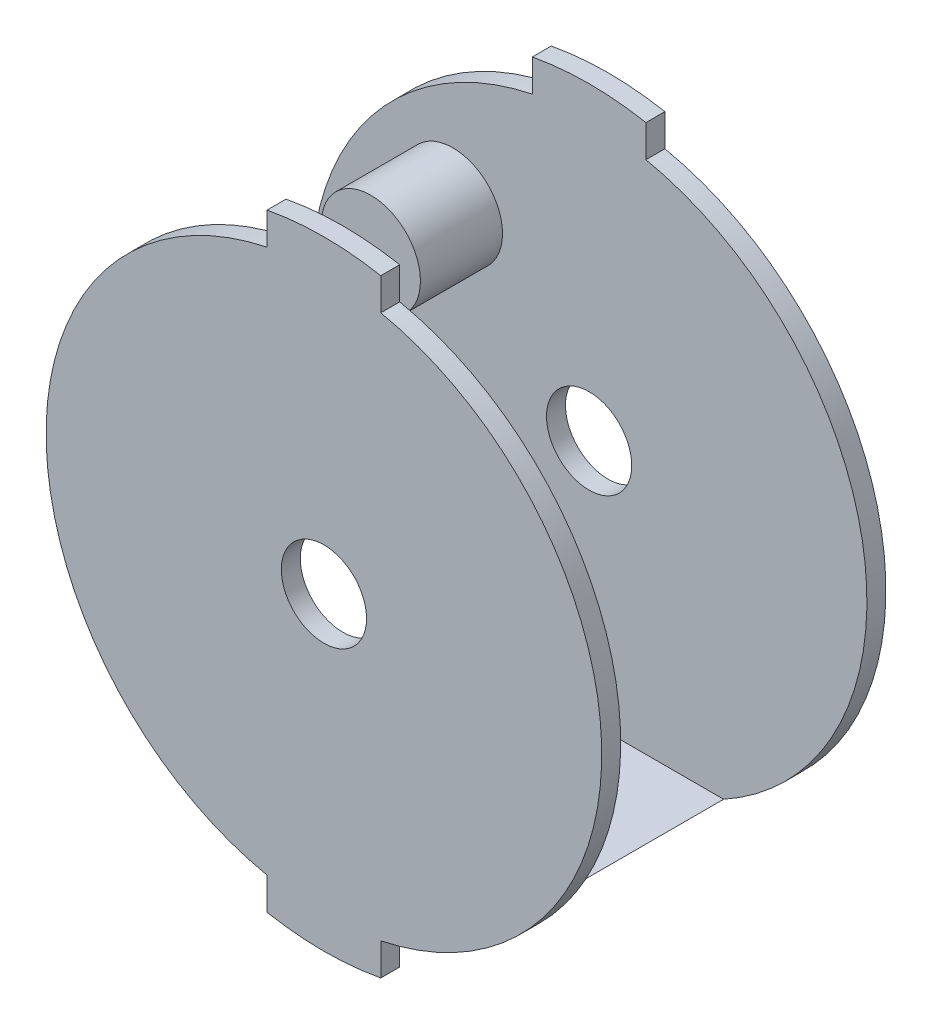
ISO-10303-21;
HEADER;
FILE_DESCRIPTION(('STEP AP214'),'2;1');
FILE_NAME('part.step','',(''),(''),'','','');
FILE_SCHEMA(('AUTOMOTIVE_DESIGN { 1 0 10303 214 1 1 1 1 }'));
ENDSEC;
DATA;
#1=APPLICATION_CONTEXT('core data for automotive mechanical design processes');
#2=APPLICATION_PROTOCOL_DEFINITION('international standard','automotive_design',2000,#1);
#3=PRODUCT_CONTEXT('',#1,'mechanical');
#4=PRODUCT('Part','Part','',(#3));
#5=PRODUCT_RELATED_PRODUCT_CATEGORY('part','',(#4));
#6=PRODUCT_DEFINITION_FORMATION('','',#4);
#7=PRODUCT_DEFINITION_CONTEXT('part definition',#1,'design');
#8=PRODUCT_DEFINITION('design','',#6,#7);
#9=PRODUCT_DEFINITION_SHAPE('','',#8);
#10=(LENGTH_UNIT() NAMED_UNIT(*) SI_UNIT(.MILLI.,.METRE.));
#11=(NAMED_UNIT(*) PLANE_ANGLE_UNIT() SI_UNIT($,.RADIAN.));
#12=(NAMED_UNIT(*) SI_UNIT($,.STERADIAN.) SOLID_ANGLE_UNIT());
#13=UNCERTAINTY_MEASURE_WITH_UNIT(LENGTH_MEASURE(1.E-05),#10,'distance_accuracy_value','');
#14=(GEOMETRIC_REPRESENTATION_CONTEXT(3) GLOBAL_UNCERTAINTY_ASSIGNED_CONTEXT((#13)) GLOBAL_UNIT_ASSIGNED_CONTEXT((#10,
#11,#12)) REPRESENTATION_CONTEXT('',''));
#15=CARTESIAN_POINT('',(0.,0.,0.));
#16=DIRECTION('',(0.,0.,1.));
#17=DIRECTION('',(1.,0.,0.));
#18=AXIS2_PLACEMENT_3D('',#15,#16,#17);
#19=CARTESIAN_POINT('',(0.,11.176,0.762));
#20=DIRECTION('',(0.,0.,1.));
#21=DIRECTION('',(1.,0.,0.));
#22=AXIS2_PLACEMENT_3D('',#19,#20,#21);
#23=PLANE('',#22);
#24=CARTESIAN_POINT('',(0.,0.,0.761999999999999));
#25=DIRECTION('',(0.,0.,-1.));
#26=DIRECTION('',(0.,1.,0.));
#27=AXIS2_PLACEMENT_3D('',#24,#25,#26);
#28=CIRCLE('',#27,1.7145);
#29=CARTESIAN_POINT('',(0.,1.7145,0.761999999999999));
#30=VERTEX_POINT('',#29);
#31=EDGE_CURVE('E205',#30,#30,#28,.T.);
#32=ORIENTED_EDGE('',*,*,#31,.T.);
#33=EDGE_LOOP('',(#32));
#34=FACE_BOUND('',#33,.T.);
#35=DIRECTION('',(0.,-1.,0.));
#36=VECTOR('',#35,1.);
#37=CARTESIAN_POINT('',(-2.286,12.234260092053,0.762000000000001));
#38=LINE('',#37,#36);
#39=CARTESIAN_POINT('',(-2.286,12.234260092053,0.762000000000001));
#40=VERTEX_POINT('',#39);
#41=CARTESIAN_POINT('',(-2.286,10.9397065774179,0.762));
#42=VERTEX_POINT('',#41);
#43=EDGE_CURVE('E204',#40,#42,#38,.T.);
#44=ORIENTED_EDGE('',*,*,#43,.T.);
#45=CARTESIAN_POINT('',(0.,0.,0.761999999999999));
#46=DIRECTION('',(0.,0.,-1.));
#47=DIRECTION('',(0.,1.,0.));
#48=AXIS2_PLACEMENT_3D('',#45,#46,#47);
#49=CIRCLE('',#48,11.176);
#50=CARTESIAN_POINT('',(-5.41055773465175,-9.779,0.761999999999998));
#51=VERTEX_POINT('',#50);
#52=EDGE_CURVE('E208',#51,#42,#49,.T.);
#53=ORIENTED_EDGE('',*,*,#52,.F.);
#54=DIRECTION('',(1.,0.,0.));
#55=VECTOR('',#54,1.);
#56=CARTESIAN_POINT('',(-11.176,-9.779,0.761999999999998));
#57=LINE('',#56,#55);
#58=CARTESIAN_POINT('',(5.41055773465175,-9.779,0.761999999999998));
#59=VERTEX_POINT('',#58);
#60=EDGE_CURVE('E213',#51,#59,#57,.T.);
#61=ORIENTED_EDGE('',*,*,#60,.T.);
#62=CARTESIAN_POINT('',(2.286,10.9397065774179,0.762));
#63=VERTEX_POINT('',#62);
#64=EDGE_CURVE('E314',#63,#59,#49,.T.);
#65=ORIENTED_EDGE('',*,*,#64,.F.);
#66=DIRECTION('',(0.,1.,0.));
#67=VECTOR('',#66,1.);
#68=CARTESIAN_POINT('',(2.286,12.234260092053,0.762000000000001));
#69=LINE('',#68,#67);
#70=CARTESIAN_POINT('',(2.286,12.234260092053,0.762000000000001));
#71=VERTEX_POINT('',#70);
#72=EDGE_CURVE('E299',#63,#71,#69,.T.);
#73=ORIENTED_EDGE('',*,*,#72,.T.);
#74=CARTESIAN_POINT('',(0.,0.,0.762000000000001));
#75=DIRECTION('',(0.,0.,1.));
#76=DIRECTION('',(1.,0.,0.));
#77=AXIS2_PLACEMENT_3D('',#74,#75,#76);
#78=CIRCLE('',#77,12.446);
#79=EDGE_CURVE('E301',#71,#40,#78,.T.);
#80=ORIENTED_EDGE('',*,*,#79,.T.);
#81=EDGE_LOOP('',(#44,#53,#61,#65,#73,#80));
#82=FACE_BOUND('',#81,.T.);
#83=CARTESIAN_POINT('',(-5.47795623385217,5.47795623385219,0.762000000000001));
#84=DIRECTION('',(0.,0.,1.));
#85=DIRECTION('',(1.,0.,0.));
#86=AXIS2_PLACEMENT_3D('',#83,#84,#85);
#87=CIRCLE('',#86,1.9939);
#88=CARTESIAN_POINT('',(-3.48405623385217,5.47795623385219,0.762000000000001));
#89=VERTEX_POINT('',#88);
#90=EDGE_CURVE('E37',#89,#89,#87,.F.);
#91=ORIENTED_EDGE('',*,*,#90,.T.);
#92=EDGE_LOOP('',(#91));
#93=FACE_BOUND('',#92,.T.);
#94=ADVANCED_FACE('F33',(#34,#82,#93),#23,.T.);
#95=CARTESIAN_POINT('',(0.,0.,11.43));
#96=DIRECTION('',(0.,0.,-1.));
#97=DIRECTION('',(-1.,0.,0.));
#98=AXIS2_PLACEMENT_3D('',#95,#96,#97);
#99=CYLINDRICAL_SURFACE('',#98,11.176);
#100=DIRECTION('',(0.,0.,-1.));
#101=VECTOR('',#100,1.);
#102=CARTESIAN_POINT('',(3.71352864537221,-10.541,11.43));
#103=LINE('',#102,#101);
#104=CARTESIAN_POINT('',(3.71352864537221,-10.541,10.668));
#105=VERTEX_POINT('',#104);
#106=CARTESIAN_POINT('',(3.71352864537221,-10.541,0.762000000000001));
#107=VERTEX_POINT('',#106);
#108=EDGE_CURVE('E173',#105,#107,#103,.T.);
#109=ORIENTED_EDGE('',*,*,#108,.T.);
#110=CARTESIAN_POINT('',(0.,0.,0.762000000000001));
#111=DIRECTION('',(0.,0.,-1.));
#112=DIRECTION('',(-1.,0.,0.));
#113=AXIS2_PLACEMENT_3D('',#110,#111,#112);
#114=CIRCLE('',#113,11.176);
#115=CARTESIAN_POINT('',(2.286,-10.9397065774179,0.762000000000001));
#116=VERTEX_POINT('',#115);
#117=EDGE_CURVE('E11',#107,#116,#114,.T.);
#118=ORIENTED_EDGE('',*,*,#117,.T.);
#119=DIRECTION('',(0.,0.,-1.));
#120=VECTOR('',#119,1.);
#121=CARTESIAN_POINT('',(2.286,-10.9397065774179,11.43));
#122=LINE('',#121,#120);
#123=CARTESIAN_POINT('',(2.286,-10.9397065774179,0.));
#124=VERTEX_POINT('',#123);
#125=EDGE_CURVE('E230',#116,#124,#122,.T.);
#126=ORIENTED_EDGE('',*,*,#125,.T.);
#127=CARTESIAN_POINT('',(0.,0.,0.));
#128=DIRECTION('',(0.,0.,1.));
#129=DIRECTION('',(1.,0.,0.));
#130=AXIS2_PLACEMENT_3D('',#127,#128,#129);
#131=CIRCLE('',#130,11.176);
#132=CARTESIAN_POINT('',(2.286,10.9397065774179,0.));
#133=VERTEX_POINT('',#132);
#134=EDGE_CURVE('E256',#124,#133,#131,.T.);
#135=ORIENTED_EDGE('',*,*,#134,.T.);
#136=DIRECTION('',(0.,0.,-1.));
#137=VECTOR('',#136,1.);
#138=CARTESIAN_POINT('',(2.286,10.9397065774179,11.43));
#139=LINE('',#138,#137);
#140=EDGE_CURVE('E234',#63,#133,#139,.T.);
#141=ORIENTED_EDGE('',*,*,#140,.F.);
#142=ORIENTED_EDGE('',*,*,#64,.T.);
#143=DIRECTION('',(0.,0.,-1.));
#144=VECTOR('',#143,1.);
#145=CARTESIAN_POINT('',(5.41055773465175,-9.779,11.43));
#146=LINE('',#145,#144);
#147=CARTESIAN_POINT('',(5.41055773465175,-9.779,10.668));
#148=VERTEX_POINT('',#147);
#149=EDGE_CURVE('E199',#59,#148,#146,.F.);
#150=ORIENTED_EDGE('',*,*,#149,.T.);
#151=CARTESIAN_POINT('',(0.,0.,10.668));
#152=DIRECTION('',(0.,0.,1.));
#153=DIRECTION('',(0.,-1.,0.));
#154=AXIS2_PLACEMENT_3D('',#151,#152,#153);
#155=CIRCLE('',#154,11.176);
#156=CARTESIAN_POINT('',(2.286,10.9397065774179,10.668));
#157=VERTEX_POINT('',#156);
#158=EDGE_CURVE('E209',#148,#157,#155,.T.);
#159=ORIENTED_EDGE('',*,*,#158,.T.);
#160=CARTESIAN_POINT('',(2.286,10.9397065774179,11.43));
#161=VERTEX_POINT('',#160);
#162=EDGE_CURVE('E231',#161,#157,#139,.T.);
#163=ORIENTED_EDGE('',*,*,#162,.F.);
#164=CARTESIAN_POINT('',(0.,0.,11.43));
#165=DIRECTION('',(0.,0.,1.));
#166=DIRECTION('',(1.,0.,0.));
#167=AXIS2_PLACEMENT_3D('',#164,#165,#166);
#168=CIRCLE('',#167,11.176);
#169=CARTESIAN_POINT('',(2.286,-10.9397065774179,11.43));
#170=VERTEX_POINT('',#169);
#171=EDGE_CURVE('E278',#170,#161,#168,.T.);
#172=ORIENTED_EDGE('',*,*,#171,.F.);
#173=CARTESIAN_POINT('',(2.286,-10.9397065774179,10.668));
#174=VERTEX_POINT('',#173);
#175=EDGE_CURVE('E191',#170,#174,#122,.T.);
#176=ORIENTED_EDGE('',*,*,#175,.T.);
#177=CARTESIAN_POINT('',(0.,0.,10.668));
#178=DIRECTION('',(0.,0.,1.));
#179=DIRECTION('',(1.,0.,0.));
#180=AXIS2_PLACEMENT_3D('',#177,#178,#179);
#181=CIRCLE('',#180,11.176);
#182=EDGE_CURVE('E42',#174,#105,#181,.T.);
#183=ORIENTED_EDGE('',*,*,#182,.T.);
#184=EDGE_LOOP('',(#109,#118,#126,#135,#141,#142,#150,#159,#163,#172,#176,#183));
#185=FACE_BOUND('',#184,.T.);
#186=ADVANCED_FACE('F188',(#185),#99,.T.);
#187=CARTESIAN_POINT('',(0.,0.,11.43));
#188=DIRECTION('',(0.,0.,-1.));
#189=DIRECTION('',(-1.,0.,0.));
#190=AXIS2_PLACEMENT_3D('',#187,#188,#189);
#191=CYLINDRICAL_SURFACE('',#190,1.7145);
#192=ORIENTED_EDGE('',*,*,#31,.F.);
#193=EDGE_LOOP('',(#192));
#194=FACE_BOUND('',#193,.T.);
#195=CARTESIAN_POINT('',(0.,0.,0.));
#196=DIRECTION('',(0.,0.,1.));
#197=DIRECTION('',(1.,0.,0.));
#198=AXIS2_PLACEMENT_3D('',#195,#196,#197);
#199=CIRCLE('',#198,1.7145);
#200=CARTESIAN_POINT('',(1.7145,0.,0.));
#201=VERTEX_POINT('',#200);
#202=EDGE_CURVE('E288',#201,#201,#199,.T.);
#203=ORIENTED_EDGE('',*,*,#202,.F.);
#204=EDGE_LOOP('',(#203));
#205=FACE_BOUND('',#204,.T.);
#206=ADVANCED_FACE('F351',(#194,#205),#191,.F.);
#207=CARTESIAN_POINT('',(-2.286,-10.9397065774179,11.43));
#208=DIRECTION('',(1.,0.,0.));
#209=DIRECTION('',(0.,0.,-1.));
#210=AXIS2_PLACEMENT_3D('',#207,#208,#209);
#211=PLANE('',#210);
#212=DIRECTION('',(0.,-1.,0.));
#213=VECTOR('',#212,1.);
#214=CARTESIAN_POINT('',(-2.286,-10.9397065774179,0.762000000000001));
#215=LINE('',#214,#213);
#216=CARTESIAN_POINT('',(-2.286,-10.9397065774179,0.762000000000001));
#217=VERTEX_POINT('',#216);
#218=CARTESIAN_POINT('',(-2.286,-12.234260092053,0.762000000000001));
#219=VERTEX_POINT('',#218);
#220=EDGE_CURVE('E291',#217,#219,#215,.T.);
#221=ORIENTED_EDGE('',*,*,#220,.F.);
#222=DIRECTION('',(0.,0.,-1.));
#223=VECTOR('',#222,1.);
#224=CARTESIAN_POINT('',(-2.286,-10.9397065774179,11.43));
#225=LINE('',#224,#223);
#226=CARTESIAN_POINT('',(-2.286,-10.9397065774179,0.));
#227=VERTEX_POINT('',#226);
#228=EDGE_CURVE('E220',#217,#227,#225,.T.);
#229=ORIENTED_EDGE('',*,*,#228,.T.);
#230=DIRECTION('',(0.,-1.,0.));
#231=VECTOR('',#230,1.);
#232=CARTESIAN_POINT('',(-2.286,-10.9397065774179,0.));
#233=LINE('',#232,#231);
#234=CARTESIAN_POINT('',(-2.286,-12.234260092053,0.));
#235=VERTEX_POINT('',#234);
#236=EDGE_CURVE('E265',#227,#235,#233,.T.);
#237=ORIENTED_EDGE('',*,*,#236,.T.);
#238=DIRECTION('',(0.,0.,-1.));
#239=VECTOR('',#238,1.);
#240=CARTESIAN_POINT('',(-2.286,-12.234260092053,11.43));
#241=LINE('',#240,#239);
#242=EDGE_CURVE('E224',#219,#235,#241,.T.);
#243=ORIENTED_EDGE('',*,*,#242,.F.);
#244=EDGE_LOOP('',(#221,#229,#237,#243));
#245=FACE_BOUND('',#244,.T.);
#246=ADVANCED_FACE('F35',(#245),#211,.F.);
#247=DIRECTION('',(0.,1.,0.));
#248=VECTOR('',#247,1.);
#249=CARTESIAN_POINT('',(-2.286,-10.9397065774179,10.668));
#250=LINE('',#249,#248);
#251=CARTESIAN_POINT('',(-2.286,-12.234260092053,10.668));
#252=VERTEX_POINT('',#251);
#253=CARTESIAN_POINT('',(-2.286,-10.9397065774179,10.668));
#254=VERTEX_POINT('',#253);
#255=EDGE_CURVE('E303',#252,#254,#250,.T.);
#256=ORIENTED_EDGE('',*,*,#255,.F.);
#257=CARTESIAN_POINT('',(-2.286,-12.234260092053,11.43));
#258=VERTEX_POINT('',#257);
#259=EDGE_CURVE('E221',#258,#252,#241,.T.);
#260=ORIENTED_EDGE('',*,*,#259,.F.);
#261=DIRECTION('',(0.,-1.,0.));
#262=VECTOR('',#261,1.);
#263=CARTESIAN_POINT('',(-2.286,-10.9397065774179,11.43));
#264=LINE('',#263,#262);
#265=CARTESIAN_POINT('',(-2.286,-10.9397065774179,11.43));
#266=VERTEX_POINT('',#265);
#267=EDGE_CURVE('E284',#266,#258,#264,.T.);
#268=ORIENTED_EDGE('',*,*,#267,.F.);
#269=EDGE_CURVE('E218',#266,#254,#225,.T.);
#270=ORIENTED_EDGE('',*,*,#269,.T.);
#271=EDGE_LOOP('',(#256,#260,#268,#270));
#272=FACE_BOUND('',#271,.T.);
#273=ADVANCED_FACE('F416',(#272),#211,.F.);
#274=CARTESIAN_POINT('',(0.,0.,11.43));
#275=DIRECTION('',(0.,0.,-1.));
#276=DIRECTION('',(-1.,0.,0.));
#277=AXIS2_PLACEMENT_3D('',#274,#275,#276);
#278=CYLINDRICAL_SURFACE('',#277,12.446);
#279=CARTESIAN_POINT('',(0.,0.,0.762000000000001));
#280=DIRECTION('',(0.,0.,1.));
#281=DIRECTION('',(1.,0.,0.));
#282=AXIS2_PLACEMENT_3D('',#279,#280,#281);
#283=CIRCLE('',#282,12.446);
#284=CARTESIAN_POINT('',(2.286,-12.234260092053,0.762000000000001));
#285=VERTEX_POINT('',#284);
#286=EDGE_CURVE('E295',#219,#285,#283,.T.);
#287=ORIENTED_EDGE('',*,*,#286,.F.);
#288=ORIENTED_EDGE('',*,*,#242,.T.);
#289=CARTESIAN_POINT('',(0.,0.,0.));
#290=DIRECTION('',(0.,0.,1.));
#291=DIRECTION('',(1.,0.,0.));
#292=AXIS2_PLACEMENT_3D('',#289,#290,#291);
#293=CIRCLE('',#292,12.446);
#294=CARTESIAN_POINT('',(2.286,-12.234260092053,0.));
#295=VERTEX_POINT('',#294);
#296=EDGE_CURVE('E262',#235,#295,#293,.T.);
#297=ORIENTED_EDGE('',*,*,#296,.T.);
#298=DIRECTION('',(0.,0.,-1.));
#299=VECTOR('',#298,1.);
#300=CARTESIAN_POINT('',(2.286,-12.234260092053,11.43));
#301=LINE('',#300,#299);
#302=EDGE_CURVE('E228',#285,#295,#301,.T.);
#303=ORIENTED_EDGE('',*,*,#302,.F.);
#304=EDGE_LOOP('',(#287,#288,#297,#303));
#305=FACE_BOUND('',#304,.T.);
#306=ADVANCED_FACE('F414',(#305),#278,.T.);
#307=CARTESIAN_POINT('',(0.,0.,10.668));
#308=DIRECTION('',(0.,0.,-1.));
#309=DIRECTION('',(-1.,0.,0.));
#310=AXIS2_PLACEMENT_3D('',#307,#308,#309);
#311=CIRCLE('',#310,12.446);
#312=CARTESIAN_POINT('',(2.286,-12.234260092053,10.668));
#313=VERTEX_POINT('',#312);
#314=EDGE_CURVE('E305',#313,#252,#311,.T.);
#315=ORIENTED_EDGE('',*,*,#314,.F.);
#316=CARTESIAN_POINT('',(2.286,-12.234260092053,11.43));
#317=VERTEX_POINT('',#316);
#318=EDGE_CURVE('E225',#317,#313,#301,.T.);
#319=ORIENTED_EDGE('',*,*,#318,.F.);
#320=CARTESIAN_POINT('',(0.,0.,11.43));
#321=DIRECTION('',(0.,0.,1.));
#322=DIRECTION('',(1.,0.,0.));
#323=AXIS2_PLACEMENT_3D('',#320,#321,#322);
#324=CIRCLE('',#323,12.446);
#325=EDGE_CURVE('E282',#258,#317,#324,.T.);
#326=ORIENTED_EDGE('',*,*,#325,.F.);
#327=ORIENTED_EDGE('',*,*,#259,.T.);
#328=EDGE_LOOP('',(#315,#319,#326,#327));
#329=FACE_BOUND('',#328,.T.);
#330=ADVANCED_FACE('F413',(#329),#278,.T.);
#331=CARTESIAN_POINT('',(2.286,-10.9397065774179,11.43));
#332=DIRECTION('',(-1.,0.,0.));
#333=DIRECTION('',(0.,0.,1.));
#334=AXIS2_PLACEMENT_3D('',#331,#332,#333);
#335=PLANE('',#334);
#336=DIRECTION('',(0.,1.,0.));
#337=VECTOR('',#336,1.);
#338=CARTESIAN_POINT('',(2.286,-10.9397065774179,0.762000000000001));
#339=LINE('',#338,#337);
#340=EDGE_CURVE('E297',#285,#116,#339,.T.);
#341=ORIENTED_EDGE('',*,*,#340,.F.);
#342=ORIENTED_EDGE('',*,*,#302,.T.);
#343=DIRECTION('',(0.,1.,0.));
#344=VECTOR('',#343,1.);
#345=CARTESIAN_POINT('',(2.286,-10.9397065774179,0.));
#346=LINE('',#345,#344);
#347=EDGE_CURVE('E259',#295,#124,#346,.T.);
#348=ORIENTED_EDGE('',*,*,#347,.T.);
#349=ORIENTED_EDGE('',*,*,#125,.F.);
#350=EDGE_LOOP('',(#341,#342,#348,#349));
#351=FACE_BOUND('',#350,.T.);
#352=ADVANCED_FACE('F370',(#351),#335,.F.);
#353=DIRECTION('',(0.,-1.,0.));
#354=VECTOR('',#353,1.);
#355=CARTESIAN_POINT('',(2.286,-10.9397065774179,10.668));
#356=LINE('',#355,#354);
#357=EDGE_CURVE('E307',#174,#313,#356,.T.);
#358=ORIENTED_EDGE('',*,*,#357,.F.);
#359=ORIENTED_EDGE('',*,*,#175,.F.);
#360=DIRECTION('',(0.,1.,0.));
#361=VECTOR('',#360,1.);
#362=CARTESIAN_POINT('',(2.286,-10.9397065774179,11.43));
#363=LINE('',#362,#361);
#364=EDGE_CURVE('E280',#317,#170,#363,.T.);
#365=ORIENTED_EDGE('',*,*,#364,.F.);
#366=ORIENTED_EDGE('',*,*,#318,.T.);
#367=EDGE_LOOP('',(#358,#359,#365,#366));
#368=FACE_BOUND('',#367,.T.);
#369=ADVANCED_FACE('F412',(#368),#335,.F.);
#370=CARTESIAN_POINT('',(2.286,12.234260092053,11.43));
#371=DIRECTION('',(-1.,0.,0.));
#372=DIRECTION('',(0.,0.,1.));
#373=AXIS2_PLACEMENT_3D('',#370,#371,#372);
#374=PLANE('',#373);
#375=ORIENTED_EDGE('',*,*,#72,.F.);
#376=ORIENTED_EDGE('',*,*,#140,.T.);
#377=DIRECTION('',(0.,1.,0.));
#378=VECTOR('',#377,1.);
#379=CARTESIAN_POINT('',(2.286,12.234260092053,0.));
#380=LINE('',#379,#378);
#381=CARTESIAN_POINT('',(2.286,12.234260092053,0.));
#382=VERTEX_POINT('',#381);
#383=EDGE_CURVE('E253',#133,#382,#380,.T.);
#384=ORIENTED_EDGE('',*,*,#383,.T.);
#385=DIRECTION('',(0.,0.,-1.));
#386=VECTOR('',#385,1.);
#387=CARTESIAN_POINT('',(2.286,12.234260092053,11.43));
#388=LINE('',#387,#386);
#389=EDGE_CURVE('E238',#71,#382,#388,.T.);
#390=ORIENTED_EDGE('',*,*,#389,.F.);
#391=EDGE_LOOP('',(#375,#376,#384,#390));
#392=FACE_BOUND('',#391,.T.);
#393=ADVANCED_FACE('F383',(#392),#374,.F.);
#394=DIRECTION('',(0.,-1.,0.));
#395=VECTOR('',#394,1.);
#396=CARTESIAN_POINT('',(2.286,12.234260092053,10.668));
#397=LINE('',#396,#395);
#398=CARTESIAN_POINT('',(2.286,12.234260092053,10.668));
#399=VERTEX_POINT('',#398);
#400=EDGE_CURVE('E309',#399,#157,#397,.T.);
#401=ORIENTED_EDGE('',*,*,#400,.F.);
#402=CARTESIAN_POINT('',(2.286,12.234260092053,11.43));
#403=VERTEX_POINT('',#402);
#404=EDGE_CURVE('E235',#403,#399,#388,.T.);
#405=ORIENTED_EDGE('',*,*,#404,.F.);
#406=DIRECTION('',(0.,1.,0.));
#407=VECTOR('',#406,1.);
#408=CARTESIAN_POINT('',(2.286,12.234260092053,11.43));
#409=LINE('',#408,#407);
#410=EDGE_CURVE('E276',#161,#403,#409,.T.);
#411=ORIENTED_EDGE('',*,*,#410,.F.);
#412=ORIENTED_EDGE('',*,*,#162,.T.);
#413=EDGE_LOOP('',(#401,#405,#411,#412));
#414=FACE_BOUND('',#413,.T.);
#415=ADVANCED_FACE('F446',(#414),#374,.F.);
#416=CARTESIAN_POINT('',(0.,0.,11.43));
#417=DIRECTION('',(0.,0.,-1.));
#418=DIRECTION('',(-1.,0.,0.));
#419=AXIS2_PLACEMENT_3D('',#416,#417,#418);
#420=CYLINDRICAL_SURFACE('',#419,12.446);
#421=ORIENTED_EDGE('',*,*,#79,.F.);
#422=ORIENTED_EDGE('',*,*,#389,.T.);
#423=CARTESIAN_POINT('',(0.,0.,0.));
#424=DIRECTION('',(0.,0.,1.));
#425=DIRECTION('',(1.,0.,0.));
#426=AXIS2_PLACEMENT_3D('',#423,#424,#425);
#427=CIRCLE('',#426,12.446);
#428=CARTESIAN_POINT('',(-2.286,12.234260092053,0.));
#429=VERTEX_POINT('',#428);
#430=EDGE_CURVE('E250',#382,#429,#427,.T.);
#431=ORIENTED_EDGE('',*,*,#430,.T.);
#432=DIRECTION('',(0.,0.,-1.));
#433=VECTOR('',#432,1.);
#434=CARTESIAN_POINT('',(-2.286,12.234260092053,11.43));
#435=LINE('',#434,#433);
#436=EDGE_CURVE('E242',#40,#429,#435,.T.);
#437=ORIENTED_EDGE('',*,*,#436,.F.);
#438=EDGE_LOOP('',(#421,#422,#431,#437));
#439=FACE_BOUND('',#438,.T.);
#440=ADVANCED_FACE('F389',(#439),#420,.T.);
#441=CARTESIAN_POINT('',(0.,0.,10.668));
#442=DIRECTION('',(0.,0.,-1.));
#443=DIRECTION('',(-1.,0.,0.));
#444=AXIS2_PLACEMENT_3D('',#441,#442,#443);
#445=CIRCLE('',#444,12.446);
#446=CARTESIAN_POINT('',(-2.286,12.234260092053,10.668));
#447=VERTEX_POINT('',#446);
#448=EDGE_CURVE('E312',#447,#399,#445,.T.);
#449=ORIENTED_EDGE('',*,*,#448,.F.);
#450=CARTESIAN_POINT('',(-2.286,12.234260092053,11.43));
#451=VERTEX_POINT('',#450);
#452=EDGE_CURVE('E239',#451,#447,#435,.T.);
#453=ORIENTED_EDGE('',*,*,#452,.F.);
#454=CARTESIAN_POINT('',(0.,0.,11.43));
#455=DIRECTION('',(0.,0.,1.));
#456=DIRECTION('',(1.,0.,0.));
#457=AXIS2_PLACEMENT_3D('',#454,#455,#456);
#458=CIRCLE('',#457,12.446);
#459=EDGE_CURVE('E274',#403,#451,#458,.T.);
#460=ORIENTED_EDGE('',*,*,#459,.F.);
#461=ORIENTED_EDGE('',*,*,#404,.T.);
#462=EDGE_LOOP('',(#449,#453,#460,#461));
#463=FACE_BOUND('',#462,.T.);
#464=ADVANCED_FACE('F444',(#463),#420,.T.);
#465=CARTESIAN_POINT('',(-2.286,12.234260092053,11.43));
#466=DIRECTION('',(1.,0.,0.));
#467=DIRECTION('',(0.,0.,-1.));
#468=AXIS2_PLACEMENT_3D('',#465,#466,#467);
#469=PLANE('',#468);
#470=ORIENTED_EDGE('',*,*,#43,.F.);
#471=ORIENTED_EDGE('',*,*,#436,.T.);
#472=DIRECTION('',(0.,-1.,0.));
#473=VECTOR('',#472,1.);
#474=CARTESIAN_POINT('',(-2.286,12.234260092053,0.));
#475=LINE('',#474,#473);
#476=CARTESIAN_POINT('',(-2.286,10.9397065774179,0.));
#477=VERTEX_POINT('',#476);
#478=EDGE_CURVE('E246',#429,#477,#475,.T.);
#479=ORIENTED_EDGE('',*,*,#478,.T.);
#480=DIRECTION('',(0.,0.,-1.));
#481=VECTOR('',#480,1.);
#482=CARTESIAN_POINT('',(-2.286,10.9397065774179,11.43));
#483=LINE('',#482,#481);
#484=EDGE_CURVE('E245',#42,#477,#483,.T.);
#485=ORIENTED_EDGE('',*,*,#484,.F.);
#486=EDGE_LOOP('',(#470,#471,#479,#485));
#487=FACE_BOUND('',#486,.T.);
#488=ADVANCED_FACE('F392',(#487),#469,.F.);
#489=DIRECTION('',(0.,1.,0.));
#490=VECTOR('',#489,1.);
#491=CARTESIAN_POINT('',(-2.286,12.234260092053,10.668));
#492=LINE('',#491,#490);
#493=CARTESIAN_POINT('',(-2.286,10.9397065774179,10.668));
#494=VERTEX_POINT('',#493);
#495=EDGE_CURVE('E216',#494,#447,#492,.T.);
#496=ORIENTED_EDGE('',*,*,#495,.F.);
#497=CARTESIAN_POINT('',(-2.286,10.9397065774179,11.43));
#498=VERTEX_POINT('',#497);
#499=EDGE_CURVE('E243',#498,#494,#483,.T.);
#500=ORIENTED_EDGE('',*,*,#499,.F.);
#501=DIRECTION('',(0.,-1.,0.));
#502=VECTOR('',#501,1.);
#503=CARTESIAN_POINT('',(-2.286,12.234260092053,11.43));
#504=LINE('',#503,#502);
#505=EDGE_CURVE('E272',#451,#498,#504,.T.);
#506=ORIENTED_EDGE('',*,*,#505,.F.);
#507=ORIENTED_EDGE('',*,*,#452,.T.);
#508=EDGE_LOOP('',(#496,#500,#506,#507));
#509=FACE_BOUND('',#508,.T.);
#510=ADVANCED_FACE('F440',(#509),#469,.F.);
#511=CARTESIAN_POINT('',(0.,0.,11.43));
#512=DIRECTION('',(0.,0.,1.));
#513=DIRECTION('',(1.,0.,0.));
#514=AXIS2_PLACEMENT_3D('',#511,#512,#513);
#515=PLANE('',#514);
#516=CARTESIAN_POINT('',(0.,0.,11.43));
#517=DIRECTION('',(0.,0.,1.));
#518=DIRECTION('',(1.,0.,0.));
#519=AXIS2_PLACEMENT_3D('',#516,#517,#518);
#520=CIRCLE('',#519,11.176);
#521=EDGE_CURVE('E249',#498,#266,#520,.T.);
#522=ORIENTED_EDGE('',*,*,#521,.T.);
#523=ORIENTED_EDGE('',*,*,#267,.T.);
#524=ORIENTED_EDGE('',*,*,#325,.T.);
#525=ORIENTED_EDGE('',*,*,#364,.T.);
#526=ORIENTED_EDGE('',*,*,#171,.T.);
#527=ORIENTED_EDGE('',*,*,#410,.T.);
#528=ORIENTED_EDGE('',*,*,#459,.T.);
#529=ORIENTED_EDGE('',*,*,#505,.T.);
#530=EDGE_LOOP('',(#522,#523,#524,#525,#526,#527,#528,#529));
#531=FACE_BOUND('',#530,.T.);
#532=CARTESIAN_POINT('',(0.,0.,11.43));
#533=DIRECTION('',(0.,0.,1.));
#534=DIRECTION('',(1.,0.,0.));
#535=AXIS2_PLACEMENT_3D('',#532,#533,#534);
#536=CIRCLE('',#535,1.7145);
#537=CARTESIAN_POINT('',(1.7145,0.,11.43));
#538=VERTEX_POINT('',#537);
#539=EDGE_CURVE('E271',#538,#538,#536,.T.);
#540=ORIENTED_EDGE('',*,*,#539,.F.);
#541=EDGE_LOOP('',(#540));
#542=FACE_BOUND('',#541,.T.);
#543=ADVANCED_FACE('F405',(#531,#542),#515,.T.);
#544=CARTESIAN_POINT('',(0.,0.,0.));
#545=DIRECTION('',(0.,0.,1.));
#546=DIRECTION('',(1.,0.,0.));
#547=AXIS2_PLACEMENT_3D('',#544,#545,#546);
#548=PLANE('',#547);
#549=ORIENTED_EDGE('',*,*,#202,.T.);
#550=EDGE_LOOP('',(#549));
#551=FACE_BOUND('',#550,.T.);
#552=CARTESIAN_POINT('',(0.,0.,0.));
#553=DIRECTION('',(0.,0.,1.));
#554=DIRECTION('',(1.,0.,0.));
#555=AXIS2_PLACEMENT_3D('',#552,#553,#554);
#556=CIRCLE('',#555,11.176);
#557=EDGE_CURVE('E268',#477,#227,#556,.T.);
#558=ORIENTED_EDGE('',*,*,#557,.F.);
#559=ORIENTED_EDGE('',*,*,#478,.F.);
#560=ORIENTED_EDGE('',*,*,#430,.F.);
#561=ORIENTED_EDGE('',*,*,#383,.F.);
#562=ORIENTED_EDGE('',*,*,#134,.F.);
#563=ORIENTED_EDGE('',*,*,#347,.F.);
#564=ORIENTED_EDGE('',*,*,#296,.F.);
#565=ORIENTED_EDGE('',*,*,#236,.F.);
#566=EDGE_LOOP('',(#558,#559,#560,#561,#562,#563,#564,#565));
#567=FACE_BOUND('',#566,.T.);
#568=ADVANCED_FACE('F377',(#551,#567),#548,.F.);
#569=ORIENTED_EDGE('',*,*,#228,.F.);
#570=CARTESIAN_POINT('',(-3.71352864537221,-10.541,0.762000000000001));
#571=VERTEX_POINT('',#570);
#572=EDGE_CURVE('E44',#217,#571,#114,.T.);
#573=ORIENTED_EDGE('',*,*,#572,.T.);
#574=DIRECTION('',(0.,0.,-1.));
#575=VECTOR('',#574,1.);
#576=CARTESIAN_POINT('',(-3.71352864537221,-10.541,11.43));
#577=LINE('',#576,#575);
#578=CARTESIAN_POINT('',(-3.71352864537221,-10.541,10.668));
#579=VERTEX_POINT('',#578);
#580=EDGE_CURVE('E194',#571,#579,#577,.F.);
#581=ORIENTED_EDGE('',*,*,#580,.T.);
#582=EDGE_CURVE('E183',#579,#254,#181,.T.);
#583=ORIENTED_EDGE('',*,*,#582,.T.);
#584=ORIENTED_EDGE('',*,*,#269,.F.);
#585=ORIENTED_EDGE('',*,*,#521,.F.);
#586=ORIENTED_EDGE('',*,*,#499,.T.);
#587=CARTESIAN_POINT('',(-5.41055773465175,-9.779,10.668));
#588=VERTEX_POINT('',#587);
#589=EDGE_CURVE('E59',#494,#588,#155,.T.);
#590=ORIENTED_EDGE('',*,*,#589,.T.);
#591=DIRECTION('',(0.,0.,-1.));
#592=VECTOR('',#591,1.);
#593=CARTESIAN_POINT('',(-5.41055773465175,-9.779,11.43));
#594=LINE('',#593,#592);
#595=EDGE_CURVE('E198',#588,#51,#594,.T.);
#596=ORIENTED_EDGE('',*,*,#595,.T.);
#597=ORIENTED_EDGE('',*,*,#52,.T.);
#598=ORIENTED_EDGE('',*,*,#484,.T.);
#599=ORIENTED_EDGE('',*,*,#557,.T.);
#600=EDGE_LOOP('',(#569,#573,#581,#583,#584,#585,#586,#590,#596,#597,#598,#599));
#601=FACE_BOUND('',#600,.T.);
#602=ADVANCED_FACE('F353',(#601),#99,.T.);
#603=CARTESIAN_POINT('',(0.,0.,10.668));
#604=DIRECTION('',(0.,0.,1.));
#605=DIRECTION('',(0.,-1.,0.));
#606=AXIS2_PLACEMENT_3D('',#603,#604,#605);
#607=CIRCLE('',#606,1.7145);
#608=CARTESIAN_POINT('',(0.,-1.7145,10.668));
#609=VERTEX_POINT('',#608);
#610=EDGE_CURVE('E210',#609,#609,#607,.T.);
#611=ORIENTED_EDGE('',*,*,#610,.F.);
#612=EDGE_LOOP('',(#611));
#613=FACE_BOUND('',#612,.T.);
#614=ORIENTED_EDGE('',*,*,#539,.T.);
#615=EDGE_LOOP('',(#614));
#616=FACE_BOUND('',#615,.T.);
#617=ADVANCED_FACE('F363',(#613,#616),#191,.F.);
#618=CARTESIAN_POINT('',(0.,11.176,10.668));
#619=DIRECTION('',(0.,0.,-1.));
#620=DIRECTION('',(-1.,0.,0.));
#621=AXIS2_PLACEMENT_3D('',#618,#619,#620);
#622=PLANE('',#621);
#623=ORIENTED_EDGE('',*,*,#400,.T.);
#624=ORIENTED_EDGE('',*,*,#158,.F.);
#625=DIRECTION('',(1.,0.,0.));
#626=VECTOR('',#625,1.);
#627=CARTESIAN_POINT('',(-11.176,-9.779,10.668));
#628=LINE('',#627,#626);
#629=EDGE_CURVE('E185',#588,#148,#628,.T.);
#630=ORIENTED_EDGE('',*,*,#629,.F.);
#631=ORIENTED_EDGE('',*,*,#589,.F.);
#632=ORIENTED_EDGE('',*,*,#495,.T.);
#633=ORIENTED_EDGE('',*,*,#448,.T.);
#634=EDGE_LOOP('',(#623,#624,#630,#631,#632,#633));
#635=FACE_BOUND('',#634,.T.);
#636=ORIENTED_EDGE('',*,*,#610,.T.);
#637=EDGE_LOOP('',(#636));
#638=FACE_BOUND('',#637,.T.);
#639=ADVANCED_FACE('F358',(#635,#638),#622,.T.);
#640=ORIENTED_EDGE('',*,*,#340,.T.);
#641=ORIENTED_EDGE('',*,*,#117,.F.);
#642=DIRECTION('',(1.,0.,0.));
#643=VECTOR('',#642,1.);
#644=CARTESIAN_POINT('',(-11.176,-10.541,0.762000000000001));
#645=LINE('',#644,#643);
#646=EDGE_CURVE('E176',#571,#107,#645,.T.);
#647=ORIENTED_EDGE('',*,*,#646,.F.);
#648=ORIENTED_EDGE('',*,*,#572,.F.);
#649=ORIENTED_EDGE('',*,*,#220,.T.);
#650=ORIENTED_EDGE('',*,*,#286,.T.);
#651=EDGE_LOOP('',(#640,#641,#647,#648,#649,#650));
#652=FACE_BOUND('',#651,.T.);
#653=ADVANCED_FACE('F345',(#652),#23,.T.);
#654=ORIENTED_EDGE('',*,*,#255,.T.);
#655=ORIENTED_EDGE('',*,*,#582,.F.);
#656=DIRECTION('',(1.,0.,0.));
#657=VECTOR('',#656,1.);
#658=CARTESIAN_POINT('',(-11.176,-10.541,10.668));
#659=LINE('',#658,#657);
#660=EDGE_CURVE('E51',#579,#105,#659,.T.);
#661=ORIENTED_EDGE('',*,*,#660,.T.);
#662=ORIENTED_EDGE('',*,*,#182,.F.);
#663=ORIENTED_EDGE('',*,*,#357,.T.);
#664=ORIENTED_EDGE('',*,*,#314,.T.);
#665=EDGE_LOOP('',(#654,#655,#661,#662,#663,#664));
#666=FACE_BOUND('',#665,.T.);
#667=ADVANCED_FACE('F180',(#666),#622,.T.);
#668=CARTESIAN_POINT('',(-11.176,-9.779,0.761999999999998));
#669=DIRECTION('',(0.,-1.,0.));
#670=DIRECTION('',(0.,0.,-1.));
#671=AXIS2_PLACEMENT_3D('',#668,#669,#670);
#672=PLANE('',#671);
#673=ORIENTED_EDGE('',*,*,#629,.T.);
#674=ORIENTED_EDGE('',*,*,#149,.F.);
#675=ORIENTED_EDGE('',*,*,#60,.F.);
#676=ORIENTED_EDGE('',*,*,#595,.F.);
#677=EDGE_LOOP('',(#673,#674,#675,#676));
#678=FACE_BOUND('',#677,.T.);
#679=ADVANCED_FACE('F340',(#678),#672,.F.);
#680=CARTESIAN_POINT('',(-11.176,-10.541,0.762000000000001));
#681=DIRECTION('',(0.,1.,0.));
#682=DIRECTION('',(0.,0.,1.));
#683=AXIS2_PLACEMENT_3D('',#680,#681,#682);
#684=PLANE('',#683);
#685=ORIENTED_EDGE('',*,*,#660,.F.);
#686=ORIENTED_EDGE('',*,*,#580,.F.);
#687=ORIENTED_EDGE('',*,*,#646,.T.);
#688=ORIENTED_EDGE('',*,*,#108,.F.);
#689=EDGE_LOOP('',(#685,#686,#687,#688));
#690=FACE_BOUND('',#689,.T.);
#691=ADVANCED_FACE('F174',(#690),#684,.F.);
#692=CARTESIAN_POINT('',(-5.47795623385217,5.47795623385219,4.064));
#693=DIRECTION('',(0.,0.,-1.));
#694=DIRECTION('',(-1.,0.,0.));
#695=AXIS2_PLACEMENT_3D('',#692,#693,#694);
#696=CYLINDRICAL_SURFACE('',#695,1.9939);
#697=ORIENTED_EDGE('',*,*,#90,.F.);
#698=EDGE_LOOP('',(#697));
#699=FACE_BOUND('',#698,.T.);
#700=CARTESIAN_POINT('',(-5.47795623385217,5.47795623385219,4.064));
#701=DIRECTION('',(0.,0.,1.));
#702=DIRECTION('',(1.,0.,0.));
#703=AXIS2_PLACEMENT_3D('',#700,#701,#702);
#704=CIRCLE('',#703,1.9939);
#705=CARTESIAN_POINT('',(-3.48405623385217,5.47795623385219,4.064));
#706=VERTEX_POINT('',#705);
#707=EDGE_CURVE('E322',#706,#706,#704,.T.);
#708=ORIENTED_EDGE('',*,*,#707,.F.);
#709=EDGE_LOOP('',(#708));
#710=FACE_BOUND('',#709,.T.);
#711=ADVANCED_FACE('F330',(#699,#710),#696,.T.);
#712=CARTESIAN_POINT('',(-5.47795623385217,5.47795623385219,4.064));
#713=DIRECTION('',(0.,0.,1.));
#714=DIRECTION('',(1.,0.,0.));
#715=AXIS2_PLACEMENT_3D('',#712,#713,#714);
#716=PLANE('',#715);
#717=ORIENTED_EDGE('',*,*,#707,.T.);
#718=EDGE_LOOP('',(#717));
#719=FACE_BOUND('',#718,.T.);
#720=ADVANCED_FACE('F333',(#719),#716,.T.);
#721=CLOSED_SHELL('',(#94,#186,#206,#246,#273,#306,#330,#352,#369,#393,#415,#440,#464,#488,#510,
#543,#568,#602,#617,#639,#653,#667,#679,#691,#711,#720));
#722=MANIFOLD_SOLID_BREP('B2',#721);
#723=ADVANCED_BREP_SHAPE_REPRESENTATION('',(#18,#722),#14);
#724=SHAPE_DEFINITION_REPRESENTATION(#9,#723);
ENDSEC;
END-ISO-10303-21;
